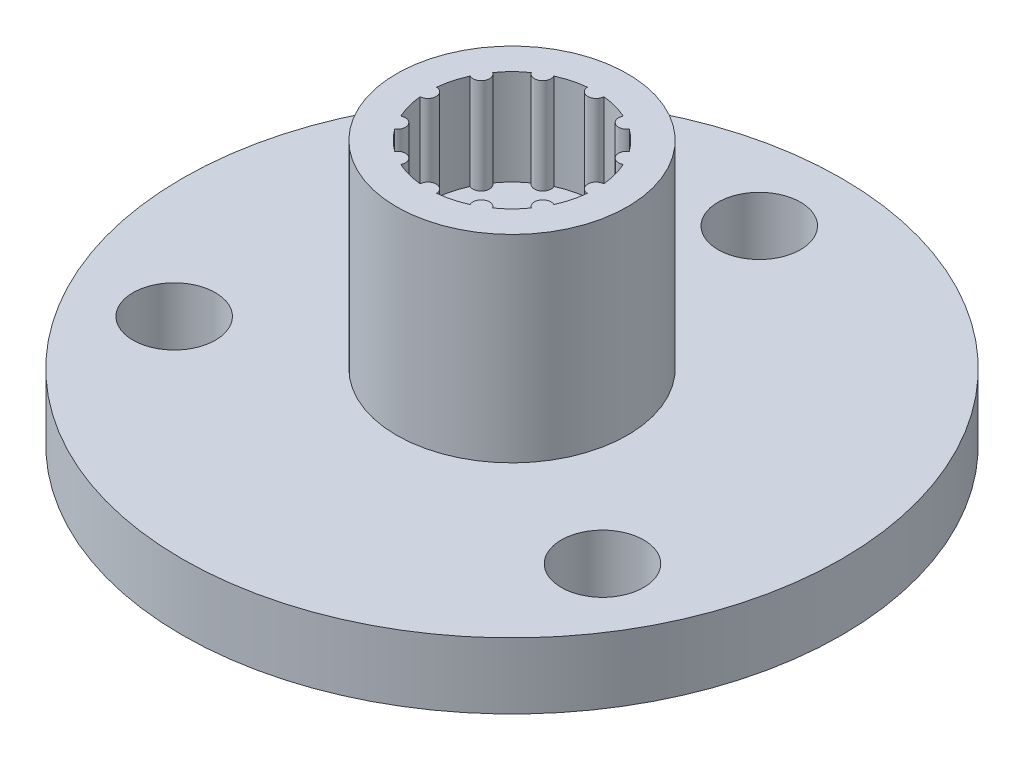
ISO-10303-21;
HEADER;
FILE_DESCRIPTION(('STEP AP214'),'2;1');
FILE_NAME('part.step','',(''),(''),'','','');
FILE_SCHEMA(('AUTOMOTIVE_DESIGN { 1 0 10303 214 1 1 1 1 }'));
ENDSEC;
DATA;
#1=APPLICATION_CONTEXT('core data for automotive mechanical design processes');
#2=APPLICATION_PROTOCOL_DEFINITION('international standard','automotive_design',2000,#1);
#3=PRODUCT_CONTEXT('',#1,'mechanical');
#4=PRODUCT('Part','Part','',(#3));
#5=PRODUCT_RELATED_PRODUCT_CATEGORY('part','',(#4));
#6=PRODUCT_DEFINITION_FORMATION('','',#4);
#7=PRODUCT_DEFINITION_CONTEXT('part definition',#1,'design');
#8=PRODUCT_DEFINITION('design','',#6,#7);
#9=PRODUCT_DEFINITION_SHAPE('','',#8);
#10=(LENGTH_UNIT() NAMED_UNIT(*) SI_UNIT(.MILLI.,.METRE.));
#11=(NAMED_UNIT(*) PLANE_ANGLE_UNIT() SI_UNIT($,.RADIAN.));
#12=(NAMED_UNIT(*) SI_UNIT($,.STERADIAN.) SOLID_ANGLE_UNIT());
#13=UNCERTAINTY_MEASURE_WITH_UNIT(LENGTH_MEASURE(1.E-05),#10,'distance_accuracy_value','');
#14=(GEOMETRIC_REPRESENTATION_CONTEXT(3) GLOBAL_UNCERTAINTY_ASSIGNED_CONTEXT((#13)) GLOBAL_UNIT_ASSIGNED_CONTEXT((#10,
#11,#12)) REPRESENTATION_CONTEXT('',''));
#15=CARTESIAN_POINT('',(0.,0.,0.));
#16=DIRECTION('',(0.,0.,1.));
#17=DIRECTION('',(1.,0.,0.));
#18=AXIS2_PLACEMENT_3D('',#15,#16,#17);
#19=CARTESIAN_POINT('',(0.,8.,0.));
#20=DIRECTION('',(0.,-1.,0.));
#21=DIRECTION('',(0.,0.,-1.));
#22=AXIS2_PLACEMENT_3D('',#19,#20,#21);
#23=CYLINDRICAL_SURFACE('',#22,2.55);
#24=DIRECTION('',(0.,1.,0.));
#25=VECTOR('',#24,1.);
#26=CARTESIAN_POINT('',(-1.05262647845771,4.5131631433541,-2.3226014502815));
#27=LINE('',#26,#25);
#28=CARTESIAN_POINT('',(-1.05262647845771,5.1,-2.3226014502815));
#29=VERTEX_POINT('',#28);
#30=CARTESIAN_POINT('',(-1.05262647845771,8.,-2.3226014502815));
#31=VERTEX_POINT('',#30);
#32=EDGE_CURVE('E212',#29,#31,#27,.T.);
#33=ORIENTED_EDGE('',*,*,#32,.F.);
#34=CARTESIAN_POINT('',(0.,5.1,0.));
#35=DIRECTION('',(0.,1.,0.));
#36=DIRECTION('',(0.,0.,1.));
#37=AXIS2_PLACEMENT_3D('',#34,#35,#36);
#38=CIRCLE('',#37,2.55);
#39=CARTESIAN_POINT('',(-0.249699454100188,5.1,-2.53774509803922));
#40=VERTEX_POINT('',#39);
#41=EDGE_CURVE('E12',#40,#29,#38,.T.);
#42=ORIENTED_EDGE('',*,*,#41,.F.);
#43=DIRECTION('',(0.,1.,0.));
#44=VECTOR('',#43,1.);
#45=CARTESIAN_POINT('',(-0.249699454100187,4.54152057377937,-2.53774509803922));
#46=LINE('',#45,#44);
#47=CARTESIAN_POINT('',(-0.249699454100187,8.,-2.53774509803922));
#48=VERTEX_POINT('',#47);
#49=EDGE_CURVE('E367',#40,#48,#46,.T.);
#50=ORIENTED_EDGE('',*,*,#49,.T.);
#51=CARTESIAN_POINT('',(0.,8.,0.));
#52=DIRECTION('',(0.,1.,0.));
#53=DIRECTION('',(0.,0.,1.));
#54=AXIS2_PLACEMENT_3D('',#51,#52,#53);
#55=CIRCLE('',#54,2.55);
#56=EDGE_CURVE('E67',#48,#31,#55,.T.);
#57=ORIENTED_EDGE('',*,*,#56,.T.);
#58=EDGE_LOOP('',(#33,#42,#50,#57));
#59=FACE_BOUND('',#58,.T.);
#60=ADVANCED_FACE('F41',(#59),#23,.F.);
#61=DIRECTION('',(0.,1.,0.));
#62=VECTOR('',#61,1.);
#63=CARTESIAN_POINT('',(-1.48511861958145,4.5131631433541,-2.07290199618132));
#64=LINE('',#63,#62);
#65=CARTESIAN_POINT('',(-1.48511861958145,5.1,-2.07290199618132));
#66=VERTEX_POINT('',#65);
#67=CARTESIAN_POINT('',(-1.48511861958145,8.,-2.07290199618132));
#68=VERTEX_POINT('',#67);
#69=EDGE_CURVE('E59',#66,#68,#64,.T.);
#70=ORIENTED_EDGE('',*,*,#69,.T.);
#71=CARTESIAN_POINT('',(-2.07290199618128,8.,-1.4851186195815));
#72=VERTEX_POINT('',#71);
#73=EDGE_CURVE('E416',#68,#72,#55,.T.);
#74=ORIENTED_EDGE('',*,*,#73,.T.);
#75=DIRECTION('',(0.,1.,0.));
#76=VECTOR('',#75,1.);
#77=CARTESIAN_POINT('',(-2.07290199618128,4.5131631433541,-1.4851186195815));
#78=LINE('',#77,#76);
#79=CARTESIAN_POINT('',(-2.07290199618128,5.1,-1.4851186195815));
#80=VERTEX_POINT('',#79);
#81=EDGE_CURVE('E228',#80,#72,#78,.T.);
#82=ORIENTED_EDGE('',*,*,#81,.F.);
#83=EDGE_CURVE('E51',#66,#80,#38,.T.);
#84=ORIENTED_EDGE('',*,*,#83,.F.);
#85=EDGE_LOOP('',(#70,#74,#82,#84));
#86=FACE_BOUND('',#85,.T.);
#87=ADVANCED_FACE('F450',(#86),#23,.F.);
#88=DIRECTION('',(0.,1.,0.));
#89=VECTOR('',#88,1.);
#90=CARTESIAN_POINT('',(-2.32260145028147,4.5131631433541,-1.05262647845777));
#91=LINE('',#90,#89);
#92=CARTESIAN_POINT('',(-2.32260145028147,5.1,-1.05262647845777));
#93=VERTEX_POINT('',#92);
#94=CARTESIAN_POINT('',(-2.32260145028147,8.,-1.05262647845777));
#95=VERTEX_POINT('',#94);
#96=EDGE_CURVE('E224',#93,#95,#91,.T.);
#97=ORIENTED_EDGE('',*,*,#96,.T.);
#98=CARTESIAN_POINT('',(-2.53774509803921,8.,-0.249699454100214));
#99=VERTEX_POINT('',#98);
#100=EDGE_CURVE('E529',#95,#99,#55,.T.);
#101=ORIENTED_EDGE('',*,*,#100,.T.);
#102=DIRECTION('',(0.,1.,0.));
#103=VECTOR('',#102,1.);
#104=CARTESIAN_POINT('',(-2.53774509803921,4.54152057377937,-0.249699454100214));
#105=LINE('',#104,#103);
#106=CARTESIAN_POINT('',(-2.53774509803921,5.1,-0.249699454100214));
#107=VERTEX_POINT('',#106);
#108=EDGE_CURVE('E242',#107,#99,#105,.T.);
#109=ORIENTED_EDGE('',*,*,#108,.F.);
#110=EDGE_CURVE('E550',#93,#107,#38,.T.);
#111=ORIENTED_EDGE('',*,*,#110,.F.);
#112=EDGE_LOOP('',(#97,#101,#109,#111));
#113=FACE_BOUND('',#112,.T.);
#114=ADVANCED_FACE('F456',(#113),#23,.F.);
#115=DIRECTION('',(0.,1.,0.));
#116=VECTOR('',#115,1.);
#117=CARTESIAN_POINT('',(-2.53774509803922,4.54152057377937,0.249699454100161));
#118=LINE('',#117,#116);
#119=CARTESIAN_POINT('',(-2.53774509803922,5.1,0.249699454100161));
#120=VERTEX_POINT('',#119);
#121=CARTESIAN_POINT('',(-2.53774509803922,8.,0.249699454100161));
#122=VERTEX_POINT('',#121);
#123=EDGE_CURVE('E241',#120,#122,#118,.T.);
#124=ORIENTED_EDGE('',*,*,#123,.T.);
#125=CARTESIAN_POINT('',(-2.3226014502815,8.,1.05262647845772));
#126=VERTEX_POINT('',#125);
#127=EDGE_CURVE('E524',#122,#126,#55,.T.);
#128=ORIENTED_EDGE('',*,*,#127,.T.);
#129=DIRECTION('',(0.,1.,0.));
#130=VECTOR('',#129,1.);
#131=CARTESIAN_POINT('',(-2.32260145028149,4.5131631433541,1.05262647845772));
#132=LINE('',#131,#130);
#133=CARTESIAN_POINT('',(-2.32260145028149,5.1,1.05262647845772));
#134=VERTEX_POINT('',#133);
#135=EDGE_CURVE('E256',#134,#126,#132,.T.);
#136=ORIENTED_EDGE('',*,*,#135,.F.);
#137=EDGE_CURVE('E552',#120,#134,#38,.T.);
#138=ORIENTED_EDGE('',*,*,#137,.F.);
#139=EDGE_LOOP('',(#124,#128,#136,#138));
#140=FACE_BOUND('',#139,.T.);
#141=ADVANCED_FACE('F678',(#140),#23,.F.);
#142=DIRECTION('',(0.,1.,0.));
#143=VECTOR('',#142,1.);
#144=CARTESIAN_POINT('',(-2.07290199618131,4.5131631433541,1.48511861958146));
#145=LINE('',#144,#143);
#146=CARTESIAN_POINT('',(-2.07290199618131,5.1,1.48511861958146));
#147=VERTEX_POINT('',#146);
#148=CARTESIAN_POINT('',(-2.07290199618131,8.,1.48511861958146));
#149=VERTEX_POINT('',#148);
#150=EDGE_CURVE('E255',#147,#149,#145,.T.);
#151=ORIENTED_EDGE('',*,*,#150,.T.);
#152=CARTESIAN_POINT('',(-1.48511861958149,8.,2.07290199618129));
#153=VERTEX_POINT('',#152);
#154=EDGE_CURVE('E519',#149,#153,#55,.T.);
#155=ORIENTED_EDGE('',*,*,#154,.T.);
#156=DIRECTION('',(0.,1.,0.));
#157=VECTOR('',#156,1.);
#158=CARTESIAN_POINT('',(-1.48511861958149,4.5131631433541,2.07290199618129));
#159=LINE('',#158,#157);
#160=CARTESIAN_POINT('',(-1.48511861958149,5.1,2.07290199618129));
#161=VERTEX_POINT('',#160);
#162=EDGE_CURVE('E270',#161,#153,#159,.T.);
#163=ORIENTED_EDGE('',*,*,#162,.F.);
#164=EDGE_CURVE('E555',#147,#161,#38,.T.);
#165=ORIENTED_EDGE('',*,*,#164,.F.);
#166=EDGE_LOOP('',(#151,#155,#163,#165));
#167=FACE_BOUND('',#166,.T.);
#168=ADVANCED_FACE('F686',(#167),#23,.F.);
#169=DIRECTION('',(0.,1.,0.));
#170=VECTOR('',#169,1.);
#171=CARTESIAN_POINT('',(-1.05262647845776,4.5131631433541,2.32260145028148));
#172=LINE('',#171,#170);
#173=CARTESIAN_POINT('',(-1.05262647845776,5.1,2.32260145028148));
#174=VERTEX_POINT('',#173);
#175=CARTESIAN_POINT('',(-1.05262647845776,8.,2.32260145028148));
#176=VERTEX_POINT('',#175);
#177=EDGE_CURVE('E269',#174,#176,#172,.T.);
#178=ORIENTED_EDGE('',*,*,#177,.T.);
#179=CARTESIAN_POINT('',(-0.249699454100188,8.,2.53774509803922));
#180=VERTEX_POINT('',#179);
#181=EDGE_CURVE('E514',#176,#180,#55,.T.);
#182=ORIENTED_EDGE('',*,*,#181,.T.);
#183=DIRECTION('',(0.,1.,0.));
#184=VECTOR('',#183,1.);
#185=CARTESIAN_POINT('',(-0.249699454100187,4.54152057377937,2.53774509803922));
#186=LINE('',#185,#184);
#187=CARTESIAN_POINT('',(-0.249699454100187,5.1,2.53774509803922));
#188=VERTEX_POINT('',#187);
#189=EDGE_CURVE('E284',#188,#180,#186,.T.);
#190=ORIENTED_EDGE('',*,*,#189,.F.);
#191=EDGE_CURVE('E558',#174,#188,#38,.T.);
#192=ORIENTED_EDGE('',*,*,#191,.F.);
#193=EDGE_LOOP('',(#178,#182,#190,#192));
#194=FACE_BOUND('',#193,.T.);
#195=ADVANCED_FACE('F694',(#194),#23,.F.);
#196=DIRECTION('',(0.,1.,0.));
#197=VECTOR('',#196,1.);
#198=CARTESIAN_POINT('',(0.249699454100187,4.54152057377937,2.53774509803922));
#199=LINE('',#198,#197);
#200=CARTESIAN_POINT('',(0.249699454100188,5.1,2.53774509803922));
#201=VERTEX_POINT('',#200);
#202=CARTESIAN_POINT('',(0.249699454100188,8.,2.53774509803922));
#203=VERTEX_POINT('',#202);
#204=EDGE_CURVE('E283',#201,#203,#199,.T.);
#205=ORIENTED_EDGE('',*,*,#204,.T.);
#206=CARTESIAN_POINT('',(1.05262647845773,8.,2.32260145028149));
#207=VERTEX_POINT('',#206);
#208=EDGE_CURVE('E509',#203,#207,#55,.T.);
#209=ORIENTED_EDGE('',*,*,#208,.T.);
#210=DIRECTION('',(0.,1.,0.));
#211=VECTOR('',#210,1.);
#212=CARTESIAN_POINT('',(1.05262647845773,4.5131631433541,2.32260145028149));
#213=LINE('',#212,#211);
#214=CARTESIAN_POINT('',(1.05262647845773,5.1,2.32260145028149));
#215=VERTEX_POINT('',#214);
#216=EDGE_CURVE('E298',#215,#207,#213,.T.);
#217=ORIENTED_EDGE('',*,*,#216,.F.);
#218=EDGE_CURVE('E561',#201,#215,#38,.T.);
#219=ORIENTED_EDGE('',*,*,#218,.F.);
#220=EDGE_LOOP('',(#205,#209,#217,#219));
#221=FACE_BOUND('',#220,.T.);
#222=ADVANCED_FACE('F702',(#221),#23,.F.);
#223=DIRECTION('',(0.,1.,0.));
#224=VECTOR('',#223,1.);
#225=CARTESIAN_POINT('',(1.48511861958146,4.5131631433541,2.07290199618131));
#226=LINE('',#225,#224);
#227=CARTESIAN_POINT('',(1.48511861958146,5.1,2.07290199618131));
#228=VERTEX_POINT('',#227);
#229=CARTESIAN_POINT('',(1.48511861958146,8.,2.07290199618131));
#230=VERTEX_POINT('',#229);
#231=EDGE_CURVE('E297',#228,#230,#226,.T.);
#232=ORIENTED_EDGE('',*,*,#231,.T.);
#233=CARTESIAN_POINT('',(2.07290199618129,8.,1.48511861958149));
#234=VERTEX_POINT('',#233);
#235=EDGE_CURVE('E504',#230,#234,#55,.T.);
#236=ORIENTED_EDGE('',*,*,#235,.T.);
#237=DIRECTION('',(0.,1.,0.));
#238=VECTOR('',#237,1.);
#239=CARTESIAN_POINT('',(2.07290199618129,4.5131631433541,1.48511861958149));
#240=LINE('',#239,#238);
#241=CARTESIAN_POINT('',(2.07290199618129,5.1,1.48511861958149));
#242=VERTEX_POINT('',#241);
#243=EDGE_CURVE('E312',#242,#234,#240,.T.);
#244=ORIENTED_EDGE('',*,*,#243,.F.);
#245=EDGE_CURVE('E564',#228,#242,#38,.T.);
#246=ORIENTED_EDGE('',*,*,#245,.F.);
#247=EDGE_LOOP('',(#232,#236,#244,#246));
#248=FACE_BOUND('',#247,.T.);
#249=ADVANCED_FACE('F710',(#248),#23,.F.);
#250=DIRECTION('',(0.,1.,0.));
#251=VECTOR('',#250,1.);
#252=CARTESIAN_POINT('',(2.32260145028148,4.5131631433541,1.05262647845775));
#253=LINE('',#252,#251);
#254=CARTESIAN_POINT('',(2.32260145028148,5.1,1.05262647845775));
#255=VERTEX_POINT('',#254);
#256=CARTESIAN_POINT('',(2.32260145028148,8.,1.05262647845775));
#257=VERTEX_POINT('',#256);
#258=EDGE_CURVE('E311',#255,#257,#253,.T.);
#259=ORIENTED_EDGE('',*,*,#258,.T.);
#260=CARTESIAN_POINT('',(2.53774509803921,8.,0.249699454100196));
#261=VERTEX_POINT('',#260);
#262=EDGE_CURVE('E502',#257,#261,#55,.T.);
#263=ORIENTED_EDGE('',*,*,#262,.T.);
#264=DIRECTION('',(0.,1.,0.));
#265=VECTOR('',#264,1.);
#266=CARTESIAN_POINT('',(2.53774509803921,4.54152057377937,0.249699454100196));
#267=LINE('',#266,#265);
#268=CARTESIAN_POINT('',(2.53774509803921,5.1,0.249699454100196));
#269=VERTEX_POINT('',#268);
#270=EDGE_CURVE('E326',#269,#261,#267,.T.);
#271=ORIENTED_EDGE('',*,*,#270,.F.);
#272=EDGE_CURVE('E567',#255,#269,#38,.T.);
#273=ORIENTED_EDGE('',*,*,#272,.F.);
#274=EDGE_LOOP('',(#259,#263,#271,#273));
#275=FACE_BOUND('',#274,.T.);
#276=ADVANCED_FACE('F478',(#275),#23,.F.);
#277=DIRECTION('',(0.,1.,0.));
#278=VECTOR('',#277,1.);
#279=CARTESIAN_POINT('',(2.53774509803922,4.54152057377937,-0.249699454100178));
#280=LINE('',#279,#278);
#281=CARTESIAN_POINT('',(2.53774509803922,5.1,-0.249699454100179));
#282=VERTEX_POINT('',#281);
#283=CARTESIAN_POINT('',(2.53774509803922,8.,-0.249699454100179));
#284=VERTEX_POINT('',#283);
#285=EDGE_CURVE('E325',#282,#284,#280,.T.);
#286=ORIENTED_EDGE('',*,*,#285,.T.);
#287=CARTESIAN_POINT('',(2.32260145028149,8.,-1.05262647845773));
#288=VERTEX_POINT('',#287);
#289=EDGE_CURVE('E494',#284,#288,#55,.T.);
#290=ORIENTED_EDGE('',*,*,#289,.T.);
#291=DIRECTION('',(0.,1.,0.));
#292=VECTOR('',#291,1.);
#293=CARTESIAN_POINT('',(2.32260145028149,4.5131631433541,-1.05262647845773));
#294=LINE('',#293,#292);
#295=CARTESIAN_POINT('',(2.32260145028149,5.1,-1.05262647845773));
#296=VERTEX_POINT('',#295);
#297=EDGE_CURVE('E340',#296,#288,#294,.T.);
#298=ORIENTED_EDGE('',*,*,#297,.F.);
#299=EDGE_CURVE('E498',#282,#296,#38,.T.);
#300=ORIENTED_EDGE('',*,*,#299,.F.);
#301=EDGE_LOOP('',(#286,#290,#298,#300));
#302=FACE_BOUND('',#301,.T.);
#303=ADVANCED_FACE('F473',(#302),#23,.F.);
#304=DIRECTION('',(0.,1.,0.));
#305=VECTOR('',#304,1.);
#306=CARTESIAN_POINT('',(2.0729019961813,4.5131631433541,-1.48511861958147));
#307=LINE('',#306,#305);
#308=CARTESIAN_POINT('',(2.0729019961813,5.1,-1.48511861958147));
#309=VERTEX_POINT('',#308);
#310=CARTESIAN_POINT('',(2.0729019961813,8.,-1.48511861958147));
#311=VERTEX_POINT('',#310);
#312=EDGE_CURVE('E339',#309,#311,#307,.T.);
#313=ORIENTED_EDGE('',*,*,#312,.T.);
#314=CARTESIAN_POINT('',(1.48511861958148,8.,-2.0729019961813));
#315=VERTEX_POINT('',#314);
#316=EDGE_CURVE('E484',#311,#315,#55,.T.);
#317=ORIENTED_EDGE('',*,*,#316,.T.);
#318=DIRECTION('',(0.,1.,0.));
#319=VECTOR('',#318,1.);
#320=CARTESIAN_POINT('',(1.48511861958148,4.5131631433541,-2.0729019961813));
#321=LINE('',#320,#319);
#322=CARTESIAN_POINT('',(1.48511861958148,5.1,-2.0729019961813));
#323=VERTEX_POINT('',#322);
#324=EDGE_CURVE('E354',#323,#315,#321,.T.);
#325=ORIENTED_EDGE('',*,*,#324,.F.);
#326=EDGE_CURVE('E485',#309,#323,#38,.T.);
#327=ORIENTED_EDGE('',*,*,#326,.F.);
#328=EDGE_LOOP('',(#313,#317,#325,#327));
#329=FACE_BOUND('',#328,.T.);
#330=ADVANCED_FACE('F444',(#329),#23,.F.);
#331=CARTESIAN_POINT('',(0.,2.,0.));
#332=DIRECTION('',(0.,1.,0.));
#333=DIRECTION('',(0.,0.,1.));
#334=AXIS2_PLACEMENT_3D('',#331,#332,#333);
#335=PLANE('',#334);
#336=CARTESIAN_POINT('',(-6.49519052838327,2.,3.75000000000003));
#337=DIRECTION('',(0.,1.,0.));
#338=DIRECTION('',(0.866025403784436,0.,-0.500000000000004));
#339=AXIS2_PLACEMENT_3D('',#336,#337,#338);
#340=CIRCLE('',#339,1.25);
#341=CARTESIAN_POINT('',(-5.41265877365273,2.,3.12500000000002));
#342=VERTEX_POINT('',#341);
#343=EDGE_CURVE('E389',#342,#342,#340,.T.);
#344=ORIENTED_EDGE('',*,*,#343,.F.);
#345=EDGE_LOOP('',(#344));
#346=FACE_BOUND('',#345,.T.);
#347=CARTESIAN_POINT('',(6.49519052838332,2.,3.74999999999994));
#348=DIRECTION('',(0.,1.,0.));
#349=DIRECTION('',(-0.866025403784443,0.,-0.499999999999992));
#350=AXIS2_PLACEMENT_3D('',#347,#348,#349);
#351=CIRCLE('',#350,1.25);
#352=CARTESIAN_POINT('',(5.41265877365277,2.,3.12499999999995));
#353=VERTEX_POINT('',#352);
#354=EDGE_CURVE('E388',#353,#353,#351,.T.);
#355=ORIENTED_EDGE('',*,*,#354,.F.);
#356=EDGE_LOOP('',(#355));
#357=FACE_BOUND('',#356,.T.);
#358=CARTESIAN_POINT('',(0.,2.,-7.5));
#359=DIRECTION('',(0.,1.,0.));
#360=DIRECTION('',(0.,0.,1.));
#361=AXIS2_PLACEMENT_3D('',#358,#359,#360);
#362=CIRCLE('',#361,1.25);
#363=CARTESIAN_POINT('',(0.,2.,-6.25));
#364=VERTEX_POINT('',#363);
#365=EDGE_CURVE('E398',#364,#364,#362,.T.);
#366=ORIENTED_EDGE('',*,*,#365,.F.);
#367=EDGE_LOOP('',(#366));
#368=FACE_BOUND('',#367,.T.);
#369=CARTESIAN_POINT('',(0.,2.,0.));
#370=DIRECTION('',(0.,1.,0.));
#371=DIRECTION('',(0.,0.,1.));
#372=AXIS2_PLACEMENT_3D('',#369,#370,#371);
#373=CIRCLE('',#372,3.5);
#374=CARTESIAN_POINT('',(0.,2.,3.5));
#375=VERTEX_POINT('',#374);
#376=EDGE_CURVE('E415',#375,#375,#373,.T.);
#377=ORIENTED_EDGE('',*,*,#376,.F.);
#378=EDGE_LOOP('',(#377));
#379=FACE_BOUND('',#378,.T.);
#380=CARTESIAN_POINT('',(0.,2.,0.));
#381=DIRECTION('',(0.,1.,0.));
#382=DIRECTION('',(0.,0.,1.));
#383=AXIS2_PLACEMENT_3D('',#380,#381,#382);
#384=CIRCLE('',#383,10.);
#385=CARTESIAN_POINT('',(0.,2.,10.));
#386=VERTEX_POINT('',#385);
#387=EDGE_CURVE('E425',#386,#386,#384,.T.);
#388=ORIENTED_EDGE('',*,*,#387,.T.);
#389=EDGE_LOOP('',(#388));
#390=FACE_BOUND('',#389,.T.);
#391=ADVANCED_FACE('F436',(#346,#357,#368,#379,#390),#335,.T.);
#392=CARTESIAN_POINT('',(0.,0.,0.));
#393=DIRECTION('',(0.,1.,0.));
#394=DIRECTION('',(0.,0.,1.));
#395=AXIS2_PLACEMENT_3D('',#392,#393,#394);
#396=PLANE('',#395);
#397=CARTESIAN_POINT('',(0.,0.,0.));
#398=DIRECTION('',(0.,-1.,0.));
#399=DIRECTION('',(0.,0.,-1.));
#400=AXIS2_PLACEMENT_3D('',#397,#398,#399);
#401=CIRCLE('',#400,2.);
#402=CARTESIAN_POINT('',(0.,0.,-2.));
#403=VERTEX_POINT('',#402);
#404=EDGE_CURVE('E376',#403,#403,#401,.T.);
#405=ORIENTED_EDGE('',*,*,#404,.F.);
#406=EDGE_LOOP('',(#405));
#407=FACE_BOUND('',#406,.T.);
#408=CARTESIAN_POINT('',(-6.49519052838327,0.,3.75000000000003));
#409=DIRECTION('',(0.,1.,0.));
#410=DIRECTION('',(0.,0.,1.));
#411=AXIS2_PLACEMENT_3D('',#408,#409,#410);
#412=CIRCLE('',#411,1.25);
#413=CARTESIAN_POINT('',(-6.49519052838327,0.,5.00000000000003));
#414=VERTEX_POINT('',#413);
#415=EDGE_CURVE('E393',#414,#414,#412,.F.);
#416=ORIENTED_EDGE('',*,*,#415,.F.);
#417=EDGE_LOOP('',(#416));
#418=FACE_BOUND('',#417,.T.);
#419=CARTESIAN_POINT('',(6.49519052838332,0.,3.74999999999994));
#420=DIRECTION('',(0.,1.,0.));
#421=DIRECTION('',(0.,0.,1.));
#422=AXIS2_PLACEMENT_3D('',#419,#420,#421);
#423=CIRCLE('',#422,1.25);
#424=CARTESIAN_POINT('',(6.49519052838332,0.,4.99999999999994));
#425=VERTEX_POINT('',#424);
#426=EDGE_CURVE('E394',#425,#425,#423,.F.);
#427=ORIENTED_EDGE('',*,*,#426,.F.);
#428=EDGE_LOOP('',(#427));
#429=FACE_BOUND('',#428,.T.);
#430=CARTESIAN_POINT('',(0.,0.,-7.5));
#431=DIRECTION('',(0.,1.,0.));
#432=DIRECTION('',(0.,0.,1.));
#433=AXIS2_PLACEMENT_3D('',#430,#431,#432);
#434=CIRCLE('',#433,1.25);
#435=CARTESIAN_POINT('',(0.,0.,-6.25));
#436=VERTEX_POINT('',#435);
#437=EDGE_CURVE('E408',#436,#436,#434,.F.);
#438=ORIENTED_EDGE('',*,*,#437,.F.);
#439=EDGE_LOOP('',(#438));
#440=FACE_BOUND('',#439,.T.);
#441=CARTESIAN_POINT('',(0.,0.,0.));
#442=DIRECTION('',(0.,1.,0.));
#443=DIRECTION('',(0.,0.,1.));
#444=AXIS2_PLACEMENT_3D('',#441,#442,#443);
#445=CIRCLE('',#444,10.);
#446=CARTESIAN_POINT('',(0.,0.,10.));
#447=VERTEX_POINT('',#446);
#448=EDGE_CURVE('E421',#447,#447,#445,.T.);
#449=ORIENTED_EDGE('',*,*,#448,.F.);
#450=EDGE_LOOP('',(#449));
#451=FACE_BOUND('',#450,.T.);
#452=ADVANCED_FACE('F434',(#407,#418,#429,#440,#451),#396,.F.);
#453=CARTESIAN_POINT('',(0.,2.,0.));
#454=DIRECTION('',(0.,-1.,0.));
#455=DIRECTION('',(0.,0.,-1.));
#456=AXIS2_PLACEMENT_3D('',#453,#454,#455);
#457=CYLINDRICAL_SURFACE('',#456,10.);
#458=ORIENTED_EDGE('',*,*,#387,.F.);
#459=EDGE_LOOP('',(#458));
#460=FACE_BOUND('',#459,.T.);
#461=ORIENTED_EDGE('',*,*,#448,.T.);
#462=EDGE_LOOP('',(#461));
#463=FACE_BOUND('',#462,.T.);
#464=ADVANCED_FACE('F43',(#460,#463),#457,.T.);
#465=CARTESIAN_POINT('',(0.,2.,0.));
#466=DIRECTION('',(0.,-1.,0.));
#467=DIRECTION('',(0.,0.,-1.));
#468=AXIS2_PLACEMENT_3D('',#465,#466,#467);
#469=CYLINDRICAL_SURFACE('',#468,1.);
#470=CARTESIAN_POINT('',(0.,4.1,0.));
#471=DIRECTION('',(0.,1.,0.));
#472=DIRECTION('',(0.,0.,1.));
#473=AXIS2_PLACEMENT_3D('',#470,#471,#472);
#474=CIRCLE('',#473,1.);
#475=CARTESIAN_POINT('',(0.,4.1,1.));
#476=VERTEX_POINT('',#475);
#477=EDGE_CURVE('E45',#476,#476,#474,.T.);
#478=ORIENTED_EDGE('',*,*,#477,.F.);
#479=EDGE_LOOP('',(#478));
#480=FACE_BOUND('',#479,.T.);
#481=CARTESIAN_POINT('',(0.,5.1,0.));
#482=DIRECTION('',(0.,1.,0.));
#483=DIRECTION('',(0.,0.,1.));
#484=AXIS2_PLACEMENT_3D('',#481,#482,#483);
#485=CIRCLE('',#484,1.);
#486=CARTESIAN_POINT('',(0.,5.1,1.));
#487=VERTEX_POINT('',#486);
#488=EDGE_CURVE('E384',#487,#487,#485,.T.);
#489=ORIENTED_EDGE('',*,*,#488,.T.);
#490=EDGE_LOOP('',(#489));
#491=FACE_BOUND('',#490,.T.);
#492=ADVANCED_FACE('F442',(#480,#491),#469,.F.);
#493=CARTESIAN_POINT('',(0.,8.,0.));
#494=DIRECTION('',(0.,1.,0.));
#495=DIRECTION('',(0.,0.,1.));
#496=AXIS2_PLACEMENT_3D('',#493,#494,#495);
#497=PLANE('',#496);
#498=CARTESIAN_POINT('',(0.,8.,0.));
#499=DIRECTION('',(0.,1.,0.));
#500=DIRECTION('',(0.,0.,1.));
#501=AXIS2_PLACEMENT_3D('',#498,#499,#500);
#502=CIRCLE('',#501,3.5);
#503=CARTESIAN_POINT('',(0.,8.,3.5));
#504=VERTEX_POINT('',#503);
#505=EDGE_CURVE('E417',#504,#504,#502,.T.);
#506=ORIENTED_EDGE('',*,*,#505,.T.);
#507=EDGE_LOOP('',(#506));
#508=FACE_BOUND('',#507,.T.);
#509=ORIENTED_EDGE('',*,*,#56,.F.);
#510=CARTESIAN_POINT('',(0.,8.,-2.55));
#511=DIRECTION('',(0.,1.,0.));
#512=DIRECTION('',(0.,0.,1.));
#513=AXIS2_PLACEMENT_3D('',#510,#511,#512);
#514=CIRCLE('',#513,0.25);
#515=CARTESIAN_POINT('',(0.249699454100187,8.,-2.53774509803922));
#516=VERTEX_POINT('',#515);
#517=EDGE_CURVE('E363',#48,#516,#514,.T.);
#518=ORIENTED_EDGE('',*,*,#517,.T.);
#519=CARTESIAN_POINT('',(1.05262647845774,8.,-2.32260145028148));
#520=VERTEX_POINT('',#519);
#521=EDGE_CURVE('E412',#520,#516,#55,.T.);
#522=ORIENTED_EDGE('',*,*,#521,.F.);
#523=CARTESIAN_POINT('',(1.275,8.,-2.20836477965032));
#524=DIRECTION('',(0.,1.,0.));
#525=DIRECTION('',(-0.500000000000001,0.,0.866025403784438));
#526=AXIS2_PLACEMENT_3D('',#523,#524,#525);
#527=CIRCLE('',#526,0.25);
#528=EDGE_CURVE('E349',#520,#315,#527,.T.);
#529=ORIENTED_EDGE('',*,*,#528,.T.);
#530=ORIENTED_EDGE('',*,*,#316,.F.);
#531=CARTESIAN_POINT('',(2.20836477965032,8.,-1.27499999999999));
#532=DIRECTION('',(0.,1.,0.));
#533=DIRECTION('',(-0.86602540378444,0.,0.499999999999998));
#534=AXIS2_PLACEMENT_3D('',#531,#532,#533);
#535=CIRCLE('',#534,0.25);
#536=EDGE_CURVE('E335',#311,#288,#535,.T.);
#537=ORIENTED_EDGE('',*,*,#536,.T.);
#538=ORIENTED_EDGE('',*,*,#289,.F.);
#539=CARTESIAN_POINT('',(2.55,8.,0.));
#540=DIRECTION('',(0.,1.,0.));
#541=DIRECTION('',(-1.,0.,0.));
#542=AXIS2_PLACEMENT_3D('',#539,#540,#541);
#543=CIRCLE('',#542,0.25);
#544=EDGE_CURVE('E321',#284,#261,#543,.T.);
#545=ORIENTED_EDGE('',*,*,#544,.T.);
#546=ORIENTED_EDGE('',*,*,#262,.F.);
#547=CARTESIAN_POINT('',(2.20836477965031,8.,1.27500000000001));
#548=DIRECTION('',(0.,1.,0.));
#549=DIRECTION('',(-0.866025403784436,0.,-0.500000000000004));
#550=AXIS2_PLACEMENT_3D('',#547,#548,#549);
#551=CIRCLE('',#550,0.25);
#552=EDGE_CURVE('E307',#257,#234,#551,.T.);
#553=ORIENTED_EDGE('',*,*,#552,.T.);
#554=ORIENTED_EDGE('',*,*,#235,.F.);
#555=CARTESIAN_POINT('',(1.27499999999999,8.,2.20836477965033));
#556=DIRECTION('',(0.,1.,0.));
#557=DIRECTION('',(-0.499999999999995,0.,-0.866025403784442));
#558=AXIS2_PLACEMENT_3D('',#555,#556,#557);
#559=CIRCLE('',#558,0.25);
#560=EDGE_CURVE('E293',#230,#207,#559,.T.);
#561=ORIENTED_EDGE('',*,*,#560,.T.);
#562=ORIENTED_EDGE('',*,*,#208,.F.);
#563=CARTESIAN_POINT('',(0.,8.,2.55));
#564=DIRECTION('',(0.,1.,0.));
#565=DIRECTION('',(0.,0.,-1.));
#566=AXIS2_PLACEMENT_3D('',#563,#564,#565);
#567=CIRCLE('',#566,0.25);
#568=EDGE_CURVE('E279',#203,#180,#567,.T.);
#569=ORIENTED_EDGE('',*,*,#568,.T.);
#570=ORIENTED_EDGE('',*,*,#181,.F.);
#571=CARTESIAN_POINT('',(-1.27500000000002,8.,2.20836477965031));
#572=DIRECTION('',(0.,1.,0.));
#573=DIRECTION('',(0.500000000000007,0.,-0.866025403784435));
#574=AXIS2_PLACEMENT_3D('',#571,#572,#573);
#575=CIRCLE('',#574,0.25);
#576=EDGE_CURVE('E265',#176,#153,#575,.T.);
#577=ORIENTED_EDGE('',*,*,#576,.T.);
#578=ORIENTED_EDGE('',*,*,#154,.F.);
#579=CARTESIAN_POINT('',(-2.20836477965033,8.,1.27499999999998));
#580=DIRECTION('',(0.,1.,0.));
#581=DIRECTION('',(0.866025403784443,0.,-0.499999999999992));
#582=AXIS2_PLACEMENT_3D('',#579,#580,#581);
#583=CIRCLE('',#582,0.25);
#584=EDGE_CURVE('E251',#149,#126,#583,.T.);
#585=ORIENTED_EDGE('',*,*,#584,.T.);
#586=ORIENTED_EDGE('',*,*,#127,.F.);
#587=CARTESIAN_POINT('',(-2.55,8.,0.));
#588=DIRECTION('',(0.,1.,0.));
#589=DIRECTION('',(1.,0.,0.));
#590=AXIS2_PLACEMENT_3D('',#587,#588,#589);
#591=CIRCLE('',#590,0.25);
#592=EDGE_CURVE('E237',#122,#99,#591,.T.);
#593=ORIENTED_EDGE('',*,*,#592,.T.);
#594=ORIENTED_EDGE('',*,*,#100,.F.);
#595=CARTESIAN_POINT('',(-2.2083647796503,8.,-1.27500000000003));
#596=DIRECTION('',(0.,1.,0.));
#597=DIRECTION('',(0.866025403784433,0.,0.50000000000001));
#598=AXIS2_PLACEMENT_3D('',#595,#596,#597);
#599=CIRCLE('',#598,0.25);
#600=EDGE_CURVE('E220',#95,#72,#599,.T.);
#601=ORIENTED_EDGE('',*,*,#600,.T.);
#602=ORIENTED_EDGE('',*,*,#73,.F.);
#603=CARTESIAN_POINT('',(-1.27499999999997,8.,-2.20836477965033));
#604=DIRECTION('',(0.,1.,0.));
#605=DIRECTION('',(0.499999999999989,0.,0.866025403784445));
#606=AXIS2_PLACEMENT_3D('',#603,#604,#605);
#607=CIRCLE('',#606,0.25);
#608=EDGE_CURVE('E581',#68,#31,#607,.T.);
#609=ORIENTED_EDGE('',*,*,#608,.T.);
#610=EDGE_LOOP('',(#509,#518,#522,#529,#530,#537,#538,#545,#546,#553,#554,#561,#562,#569,#570,
#577,#578,#585,#586,#593,#594,#601,#602,#609));
#611=FACE_BOUND('',#610,.T.);
#612=ADVANCED_FACE('F469',(#508,#611),#497,.T.);
#613=CARTESIAN_POINT('',(0.,8.,0.));
#614=DIRECTION('',(0.,-1.,0.));
#615=DIRECTION('',(0.,0.,-1.));
#616=AXIS2_PLACEMENT_3D('',#613,#614,#615);
#617=CYLINDRICAL_SURFACE('',#616,3.5);
#618=ORIENTED_EDGE('',*,*,#505,.F.);
#619=EDGE_LOOP('',(#618));
#620=FACE_BOUND('',#619,.T.);
#621=ORIENTED_EDGE('',*,*,#376,.T.);
#622=EDGE_LOOP('',(#621));
#623=FACE_BOUND('',#622,.T.);
#624=ADVANCED_FACE('F461',(#620,#623),#617,.T.);
#625=DIRECTION('',(0.,1.,0.));
#626=VECTOR('',#625,1.);
#627=CARTESIAN_POINT('',(1.05262647845774,4.5131631433541,-2.32260145028148));
#628=LINE('',#627,#626);
#629=CARTESIAN_POINT('',(1.05262647845774,5.1,-2.32260145028148));
#630=VERTEX_POINT('',#629);
#631=EDGE_CURVE('E353',#630,#520,#628,.T.);
#632=ORIENTED_EDGE('',*,*,#631,.T.);
#633=ORIENTED_EDGE('',*,*,#521,.T.);
#634=DIRECTION('',(0.,1.,0.));
#635=VECTOR('',#634,1.);
#636=CARTESIAN_POINT('',(0.249699454100187,4.54152057377937,-2.53774509803922));
#637=LINE('',#636,#635);
#638=CARTESIAN_POINT('',(0.249699454100187,5.1,-2.53774509803922));
#639=VERTEX_POINT('',#638);
#640=EDGE_CURVE('E368',#639,#516,#637,.T.);
#641=ORIENTED_EDGE('',*,*,#640,.F.);
#642=EDGE_CURVE('E52',#630,#639,#38,.T.);
#643=ORIENTED_EDGE('',*,*,#642,.F.);
#644=EDGE_LOOP('',(#632,#633,#641,#643));
#645=FACE_BOUND('',#644,.T.);
#646=ADVANCED_FACE('F452',(#645),#23,.F.);
#647=CARTESIAN_POINT('',(0.,-0.00100000000000013,-7.5));
#648=DIRECTION('',(0.,1.,0.));
#649=DIRECTION('',(0.,0.,1.));
#650=AXIS2_PLACEMENT_3D('',#647,#648,#649);
#651=CYLINDRICAL_SURFACE('',#650,1.25);
#652=ORIENTED_EDGE('',*,*,#365,.T.);
#653=EDGE_LOOP('',(#652));
#654=FACE_BOUND('',#653,.T.);
#655=ORIENTED_EDGE('',*,*,#437,.T.);
#656=EDGE_LOOP('',(#655));
#657=FACE_BOUND('',#656,.T.);
#658=ADVANCED_FACE('F460',(#654,#657),#651,.F.);
#659=CARTESIAN_POINT('',(6.49519052838332,-0.00100000000000013,3.74999999999994));
#660=DIRECTION('',(0.,1.,0.));
#661=DIRECTION('',(0.,0.,1.));
#662=AXIS2_PLACEMENT_3D('',#659,#660,#661);
#663=CYLINDRICAL_SURFACE('',#662,1.25);
#664=ORIENTED_EDGE('',*,*,#354,.T.);
#665=EDGE_LOOP('',(#664));
#666=FACE_BOUND('',#665,.T.);
#667=ORIENTED_EDGE('',*,*,#426,.T.);
#668=EDGE_LOOP('',(#667));
#669=FACE_BOUND('',#668,.T.);
#670=ADVANCED_FACE('F467',(#666,#669),#663,.F.);
#671=CARTESIAN_POINT('',(-6.49519052838327,-0.00100000000000013,3.75000000000003));
#672=DIRECTION('',(0.,1.,0.));
#673=DIRECTION('',(0.,0.,1.));
#674=AXIS2_PLACEMENT_3D('',#671,#672,#673);
#675=CYLINDRICAL_SURFACE('',#674,1.25);
#676=ORIENTED_EDGE('',*,*,#343,.T.);
#677=EDGE_LOOP('',(#676));
#678=FACE_BOUND('',#677,.T.);
#679=ORIENTED_EDGE('',*,*,#415,.T.);
#680=EDGE_LOOP('',(#679));
#681=FACE_BOUND('',#680,.T.);
#682=ADVANCED_FACE('F609',(#678,#681),#675,.F.);
#683=CARTESIAN_POINT('',(0.,5.1,0.));
#684=DIRECTION('',(0.,1.,0.));
#685=DIRECTION('',(0.,0.,1.));
#686=AXIS2_PLACEMENT_3D('',#683,#684,#685);
#687=PLANE('',#686);
#688=CARTESIAN_POINT('',(-1.27499999999997,5.1,-2.20836477965033));
#689=DIRECTION('',(0.,1.,0.));
#690=DIRECTION('',(0.,0.,1.));
#691=AXIS2_PLACEMENT_3D('',#688,#689,#690);
#692=CIRCLE('',#691,0.25);
#693=EDGE_CURVE('E208',#29,#66,#692,.F.);
#694=ORIENTED_EDGE('',*,*,#693,.T.);
#695=ORIENTED_EDGE('',*,*,#83,.T.);
#696=CARTESIAN_POINT('',(-2.2083647796503,5.1,-1.27500000000003));
#697=DIRECTION('',(0.,1.,0.));
#698=DIRECTION('',(0.,0.,1.));
#699=AXIS2_PLACEMENT_3D('',#696,#697,#698);
#700=CIRCLE('',#699,0.25);
#701=EDGE_CURVE('E232',#80,#93,#700,.F.);
#702=ORIENTED_EDGE('',*,*,#701,.T.);
#703=ORIENTED_EDGE('',*,*,#110,.T.);
#704=CARTESIAN_POINT('',(-2.55,5.1,0.));
#705=DIRECTION('',(0.,1.,0.));
#706=DIRECTION('',(0.,0.,1.));
#707=AXIS2_PLACEMENT_3D('',#704,#705,#706);
#708=CIRCLE('',#707,0.25);
#709=EDGE_CURVE('E246',#107,#120,#708,.F.);
#710=ORIENTED_EDGE('',*,*,#709,.T.);
#711=ORIENTED_EDGE('',*,*,#137,.T.);
#712=CARTESIAN_POINT('',(-2.20836477965033,5.1,1.27499999999998));
#713=DIRECTION('',(0.,1.,0.));
#714=DIRECTION('',(0.,0.,1.));
#715=AXIS2_PLACEMENT_3D('',#712,#713,#714);
#716=CIRCLE('',#715,0.25);
#717=EDGE_CURVE('E260',#134,#147,#716,.F.);
#718=ORIENTED_EDGE('',*,*,#717,.T.);
#719=ORIENTED_EDGE('',*,*,#164,.T.);
#720=CARTESIAN_POINT('',(-1.27500000000002,5.1,2.20836477965031));
#721=DIRECTION('',(0.,1.,0.));
#722=DIRECTION('',(0.,0.,1.));
#723=AXIS2_PLACEMENT_3D('',#720,#721,#722);
#724=CIRCLE('',#723,0.25);
#725=EDGE_CURVE('E274',#161,#174,#724,.F.);
#726=ORIENTED_EDGE('',*,*,#725,.T.);
#727=ORIENTED_EDGE('',*,*,#191,.T.);
#728=CARTESIAN_POINT('',(0.,5.1,2.55));
#729=DIRECTION('',(0.,1.,0.));
#730=DIRECTION('',(0.,0.,1.));
#731=AXIS2_PLACEMENT_3D('',#728,#729,#730);
#732=CIRCLE('',#731,0.25);
#733=EDGE_CURVE('E288',#188,#201,#732,.F.);
#734=ORIENTED_EDGE('',*,*,#733,.T.);
#735=ORIENTED_EDGE('',*,*,#218,.T.);
#736=CARTESIAN_POINT('',(1.27499999999999,5.1,2.20836477965033));
#737=DIRECTION('',(0.,1.,0.));
#738=DIRECTION('',(0.,0.,1.));
#739=AXIS2_PLACEMENT_3D('',#736,#737,#738);
#740=CIRCLE('',#739,0.25);
#741=EDGE_CURVE('E302',#215,#228,#740,.F.);
#742=ORIENTED_EDGE('',*,*,#741,.T.);
#743=ORIENTED_EDGE('',*,*,#245,.T.);
#744=CARTESIAN_POINT('',(2.20836477965031,5.1,1.27500000000001));
#745=DIRECTION('',(0.,1.,0.));
#746=DIRECTION('',(0.,0.,1.));
#747=AXIS2_PLACEMENT_3D('',#744,#745,#746);
#748=CIRCLE('',#747,0.25);
#749=EDGE_CURVE('E316',#242,#255,#748,.F.);
#750=ORIENTED_EDGE('',*,*,#749,.T.);
#751=ORIENTED_EDGE('',*,*,#272,.T.);
#752=CARTESIAN_POINT('',(2.55,5.1,0.));
#753=DIRECTION('',(0.,1.,0.));
#754=DIRECTION('',(0.,0.,1.));
#755=AXIS2_PLACEMENT_3D('',#752,#753,#754);
#756=CIRCLE('',#755,0.25);
#757=EDGE_CURVE('E330',#269,#282,#756,.F.);
#758=ORIENTED_EDGE('',*,*,#757,.T.);
#759=ORIENTED_EDGE('',*,*,#299,.T.);
#760=CARTESIAN_POINT('',(2.20836477965032,5.1,-1.27499999999999));
#761=DIRECTION('',(0.,1.,0.));
#762=DIRECTION('',(0.,0.,1.));
#763=AXIS2_PLACEMENT_3D('',#760,#761,#762);
#764=CIRCLE('',#763,0.25);
#765=EDGE_CURVE('E344',#296,#309,#764,.F.);
#766=ORIENTED_EDGE('',*,*,#765,.T.);
#767=ORIENTED_EDGE('',*,*,#326,.T.);
#768=CARTESIAN_POINT('',(1.275,5.1,-2.20836477965032));
#769=DIRECTION('',(0.,1.,0.));
#770=DIRECTION('',(0.,0.,1.));
#771=AXIS2_PLACEMENT_3D('',#768,#769,#770);
#772=CIRCLE('',#771,0.25);
#773=EDGE_CURVE('E358',#323,#630,#772,.F.);
#774=ORIENTED_EDGE('',*,*,#773,.T.);
#775=ORIENTED_EDGE('',*,*,#642,.T.);
#776=CARTESIAN_POINT('',(0.,5.1,-2.55));
#777=DIRECTION('',(0.,1.,0.));
#778=DIRECTION('',(0.,0.,1.));
#779=AXIS2_PLACEMENT_3D('',#776,#777,#778);
#780=CIRCLE('',#779,0.25);
#781=EDGE_CURVE('E210',#639,#40,#780,.F.);
#782=ORIENTED_EDGE('',*,*,#781,.T.);
#783=ORIENTED_EDGE('',*,*,#41,.T.);
#784=EDGE_LOOP('',(#694,#695,#702,#703,#710,#711,#718,#719,#726,#727,#734,#735,#742,#743,#750,
#751,#758,#759,#766,#767,#774,#775,#782,#783));
#785=FACE_BOUND('',#784,.T.);
#786=ORIENTED_EDGE('',*,*,#488,.F.);
#787=EDGE_LOOP('',(#786));
#788=FACE_BOUND('',#787,.T.);
#789=ADVANCED_FACE('F205',(#785,#788),#687,.T.);
#790=CARTESIAN_POINT('',(0.,4.1,0.));
#791=DIRECTION('',(0.,1.,0.));
#792=DIRECTION('',(0.,0.,1.));
#793=AXIS2_PLACEMENT_3D('',#790,#791,#792);
#794=PLANE('',#793);
#795=ORIENTED_EDGE('',*,*,#477,.T.);
#796=EDGE_LOOP('',(#795));
#797=FACE_BOUND('',#796,.T.);
#798=CARTESIAN_POINT('',(0.,4.1,0.));
#799=DIRECTION('',(0.,1.,0.));
#800=DIRECTION('',(0.,0.,1.));
#801=AXIS2_PLACEMENT_3D('',#798,#799,#800);
#802=CIRCLE('',#801,2.);
#803=CARTESIAN_POINT('',(0.,4.1,2.));
#804=VERTEX_POINT('',#803);
#805=EDGE_CURVE('E380',#804,#804,#802,.F.);
#806=ORIENTED_EDGE('',*,*,#805,.T.);
#807=EDGE_LOOP('',(#806));
#808=FACE_BOUND('',#807,.T.);
#809=ADVANCED_FACE('F602',(#797,#808),#794,.F.);
#810=CARTESIAN_POINT('',(0.,10.7568542494924,0.));
#811=DIRECTION('',(0.,-1.,0.));
#812=DIRECTION('',(0.,0.,-1.));
#813=AXIS2_PLACEMENT_3D('',#810,#811,#812);
#814=CYLINDRICAL_SURFACE('',#813,2.);
#815=ORIENTED_EDGE('',*,*,#404,.T.);
#816=EDGE_LOOP('',(#815));
#817=FACE_BOUND('',#816,.T.);
#818=ORIENTED_EDGE('',*,*,#805,.F.);
#819=EDGE_LOOP('',(#818));
#820=FACE_BOUND('',#819,.T.);
#821=ADVANCED_FACE('F596',(#817,#820),#814,.F.);
#822=CARTESIAN_POINT('',(0.,4.54152057377937,-2.55));
#823=DIRECTION('',(0.,1.,0.));
#824=DIRECTION('',(0.,0.,1.));
#825=AXIS2_PLACEMENT_3D('',#822,#823,#824);
#826=CYLINDRICAL_SURFACE('',#825,0.25);
#827=ORIENTED_EDGE('',*,*,#781,.F.);
#828=ORIENTED_EDGE('',*,*,#640,.T.);
#829=ORIENTED_EDGE('',*,*,#517,.F.);
#830=ORIENTED_EDGE('',*,*,#49,.F.);
#831=EDGE_LOOP('',(#827,#828,#829,#830));
#832=FACE_BOUND('',#831,.T.);
#833=ADVANCED_FACE('F580',(#832),#826,.T.);
#834=CARTESIAN_POINT('',(1.275,4.5131631433541,-2.20836477965032));
#835=DIRECTION('',(0.,1.,0.));
#836=DIRECTION('',(0.,0.,1.));
#837=AXIS2_PLACEMENT_3D('',#834,#835,#836);
#838=CYLINDRICAL_SURFACE('',#837,0.25);
#839=ORIENTED_EDGE('',*,*,#773,.F.);
#840=ORIENTED_EDGE('',*,*,#324,.T.);
#841=ORIENTED_EDGE('',*,*,#528,.F.);
#842=ORIENTED_EDGE('',*,*,#631,.F.);
#843=EDGE_LOOP('',(#839,#840,#841,#842));
#844=FACE_BOUND('',#843,.T.);
#845=ADVANCED_FACE('F587',(#844),#838,.T.);
#846=CARTESIAN_POINT('',(2.20836477965032,4.5131631433541,-1.27499999999999));
#847=DIRECTION('',(0.,1.,0.));
#848=DIRECTION('',(0.,0.,1.));
#849=AXIS2_PLACEMENT_3D('',#846,#847,#848);
#850=CYLINDRICAL_SURFACE('',#849,0.25);
#851=ORIENTED_EDGE('',*,*,#765,.F.);
#852=ORIENTED_EDGE('',*,*,#297,.T.);
#853=ORIENTED_EDGE('',*,*,#536,.F.);
#854=ORIENTED_EDGE('',*,*,#312,.F.);
#855=EDGE_LOOP('',(#851,#852,#853,#854));
#856=FACE_BOUND('',#855,.T.);
#857=ADVANCED_FACE('F495',(#856),#850,.T.);
#858=CARTESIAN_POINT('',(2.55,4.54152057377937,0.));
#859=DIRECTION('',(0.,1.,0.));
#860=DIRECTION('',(0.,0.,1.));
#861=AXIS2_PLACEMENT_3D('',#858,#859,#860);
#862=CYLINDRICAL_SURFACE('',#861,0.25);
#863=ORIENTED_EDGE('',*,*,#757,.F.);
#864=ORIENTED_EDGE('',*,*,#270,.T.);
#865=ORIENTED_EDGE('',*,*,#544,.F.);
#866=ORIENTED_EDGE('',*,*,#285,.F.);
#867=EDGE_LOOP('',(#863,#864,#865,#866));
#868=FACE_BOUND('',#867,.T.);
#869=ADVANCED_FACE('F594',(#868),#862,.T.);
#870=CARTESIAN_POINT('',(2.20836477965031,4.5131631433541,1.27500000000001));
#871=DIRECTION('',(0.,1.,0.));
#872=DIRECTION('',(0.,0.,1.));
#873=AXIS2_PLACEMENT_3D('',#870,#871,#872);
#874=CYLINDRICAL_SURFACE('',#873,0.25);
#875=ORIENTED_EDGE('',*,*,#749,.F.);
#876=ORIENTED_EDGE('',*,*,#243,.T.);
#877=ORIENTED_EDGE('',*,*,#552,.F.);
#878=ORIENTED_EDGE('',*,*,#258,.F.);
#879=EDGE_LOOP('',(#875,#876,#877,#878));
#880=FACE_BOUND('',#879,.T.);
#881=ADVANCED_FACE('F851',(#880),#874,.T.);
#882=CARTESIAN_POINT('',(1.27499999999999,4.5131631433541,2.20836477965033));
#883=DIRECTION('',(0.,1.,0.));
#884=DIRECTION('',(0.,0.,1.));
#885=AXIS2_PLACEMENT_3D('',#882,#883,#884);
#886=CYLINDRICAL_SURFACE('',#885,0.25);
#887=ORIENTED_EDGE('',*,*,#741,.F.);
#888=ORIENTED_EDGE('',*,*,#216,.T.);
#889=ORIENTED_EDGE('',*,*,#560,.F.);
#890=ORIENTED_EDGE('',*,*,#231,.F.);
#891=EDGE_LOOP('',(#887,#888,#889,#890));
#892=FACE_BOUND('',#891,.T.);
#893=ADVANCED_FACE('F859',(#892),#886,.T.);
#894=CARTESIAN_POINT('',(0.,4.54152057377937,2.55));
#895=DIRECTION('',(0.,1.,0.));
#896=DIRECTION('',(0.,0.,1.));
#897=AXIS2_PLACEMENT_3D('',#894,#895,#896);
#898=CYLINDRICAL_SURFACE('',#897,0.25);
#899=ORIENTED_EDGE('',*,*,#733,.F.);
#900=ORIENTED_EDGE('',*,*,#189,.T.);
#901=ORIENTED_EDGE('',*,*,#568,.F.);
#902=ORIENTED_EDGE('',*,*,#204,.F.);
#903=EDGE_LOOP('',(#899,#900,#901,#902));
#904=FACE_BOUND('',#903,.T.);
#905=ADVANCED_FACE('F868',(#904),#898,.T.);
#906=CARTESIAN_POINT('',(-1.27500000000002,4.5131631433541,2.20836477965031));
#907=DIRECTION('',(0.,1.,0.));
#908=DIRECTION('',(0.,0.,1.));
#909=AXIS2_PLACEMENT_3D('',#906,#907,#908);
#910=CYLINDRICAL_SURFACE('',#909,0.25);
#911=ORIENTED_EDGE('',*,*,#725,.F.);
#912=ORIENTED_EDGE('',*,*,#162,.T.);
#913=ORIENTED_EDGE('',*,*,#576,.F.);
#914=ORIENTED_EDGE('',*,*,#177,.F.);
#915=EDGE_LOOP('',(#911,#912,#913,#914));
#916=FACE_BOUND('',#915,.T.);
#917=ADVANCED_FACE('F877',(#916),#910,.T.);
#918=CARTESIAN_POINT('',(-2.20836477965033,4.5131631433541,1.27499999999998));
#919=DIRECTION('',(0.,1.,0.));
#920=DIRECTION('',(0.,0.,1.));
#921=AXIS2_PLACEMENT_3D('',#918,#919,#920);
#922=CYLINDRICAL_SURFACE('',#921,0.25);
#923=ORIENTED_EDGE('',*,*,#717,.F.);
#924=ORIENTED_EDGE('',*,*,#135,.T.);
#925=ORIENTED_EDGE('',*,*,#584,.F.);
#926=ORIENTED_EDGE('',*,*,#150,.F.);
#927=EDGE_LOOP('',(#923,#924,#925,#926));
#928=FACE_BOUND('',#927,.T.);
#929=ADVANCED_FACE('F886',(#928),#922,.T.);
#930=CARTESIAN_POINT('',(-2.55,4.54152057377937,0.));
#931=DIRECTION('',(0.,1.,0.));
#932=DIRECTION('',(0.,0.,1.));
#933=AXIS2_PLACEMENT_3D('',#930,#931,#932);
#934=CYLINDRICAL_SURFACE('',#933,0.25);
#935=ORIENTED_EDGE('',*,*,#709,.F.);
#936=ORIENTED_EDGE('',*,*,#108,.T.);
#937=ORIENTED_EDGE('',*,*,#592,.F.);
#938=ORIENTED_EDGE('',*,*,#123,.F.);
#939=EDGE_LOOP('',(#935,#936,#937,#938));
#940=FACE_BOUND('',#939,.T.);
#941=ADVANCED_FACE('F548',(#940),#934,.T.);
#942=CARTESIAN_POINT('',(-2.2083647796503,4.5131631433541,-1.27500000000003));
#943=DIRECTION('',(0.,1.,0.));
#944=DIRECTION('',(0.,0.,1.));
#945=AXIS2_PLACEMENT_3D('',#942,#943,#944);
#946=CYLINDRICAL_SURFACE('',#945,0.25);
#947=ORIENTED_EDGE('',*,*,#701,.F.);
#948=ORIENTED_EDGE('',*,*,#81,.T.);
#949=ORIENTED_EDGE('',*,*,#600,.F.);
#950=ORIENTED_EDGE('',*,*,#96,.F.);
#951=EDGE_LOOP('',(#947,#948,#949,#950));
#952=FACE_BOUND('',#951,.T.);
#953=ADVANCED_FACE('F542',(#952),#946,.T.);
#954=CARTESIAN_POINT('',(-1.27499999999997,4.5131631433541,-2.20836477965033));
#955=DIRECTION('',(0.,1.,0.));
#956=DIRECTION('',(0.,0.,1.));
#957=AXIS2_PLACEMENT_3D('',#954,#955,#956);
#958=CYLINDRICAL_SURFACE('',#957,0.25);
#959=ORIENTED_EDGE('',*,*,#693,.F.);
#960=ORIENTED_EDGE('',*,*,#32,.T.);
#961=ORIENTED_EDGE('',*,*,#608,.F.);
#962=ORIENTED_EDGE('',*,*,#69,.F.);
#963=EDGE_LOOP('',(#959,#960,#961,#962));
#964=FACE_BOUND('',#963,.T.);
#965=ADVANCED_FACE('F218',(#964),#958,.T.);
#966=CLOSED_SHELL('',(#60,#87,#114,#141,#168,#195,#222,#249,#276,#303,#330,#391,#452,#464,#492,
#612,#624,#646,#658,#670,#682,#789,#809,#821,#833,#845,#857,#869,#881,#893,#905,#917,#929,#941,
#953,#965));
#967=MANIFOLD_SOLID_BREP('B2',#966);
#968=ADVANCED_BREP_SHAPE_REPRESENTATION('',(#18,#967),#14);
#969=SHAPE_DEFINITION_REPRESENTATION(#9,#968);
ENDSEC;
END-ISO-10303-21;
